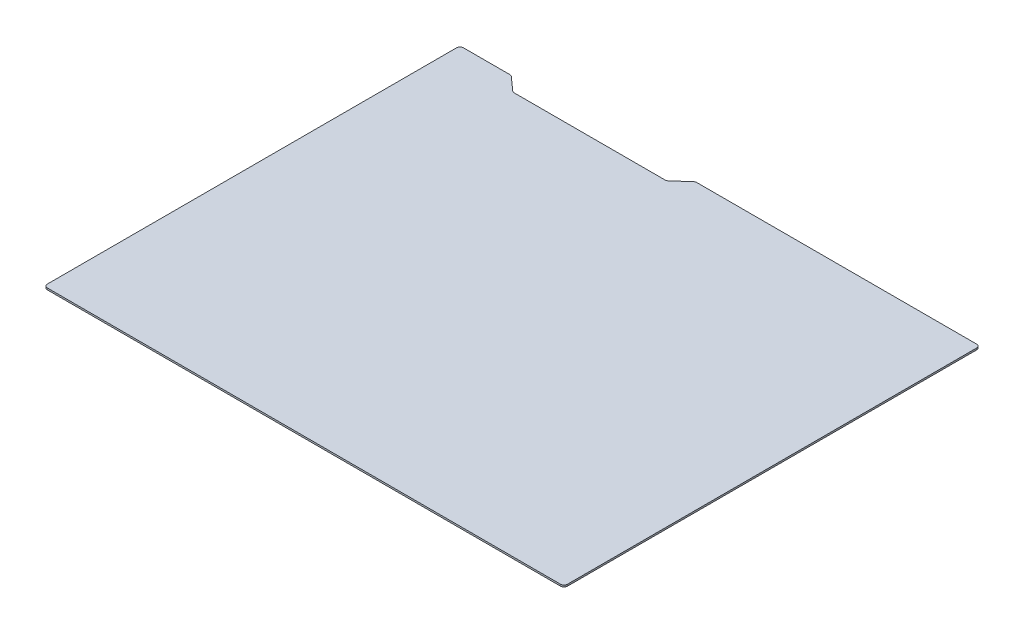
ISO-10303-21;
HEADER;
FILE_DESCRIPTION(('STEP AP214'),'2;1');
FILE_NAME('part.step','',(''),(''),'','','');
FILE_SCHEMA(('AUTOMOTIVE_DESIGN { 1 0 10303 214 1 1 1 1 }'));
ENDSEC;
DATA;
#1=APPLICATION_CONTEXT('core data for automotive mechanical design processes');
#2=APPLICATION_PROTOCOL_DEFINITION('international standard','automotive_design',2000,#1);
#3=PRODUCT_CONTEXT('',#1,'mechanical');
#4=PRODUCT('Part','Part','',(#3));
#5=PRODUCT_RELATED_PRODUCT_CATEGORY('part','',(#4));
#6=PRODUCT_DEFINITION_FORMATION('','',#4);
#7=PRODUCT_DEFINITION_CONTEXT('part definition',#1,'design');
#8=PRODUCT_DEFINITION('design','',#6,#7);
#9=PRODUCT_DEFINITION_SHAPE('','',#8);
#10=(LENGTH_UNIT() NAMED_UNIT(*) SI_UNIT(.MILLI.,.METRE.));
#11=(NAMED_UNIT(*) PLANE_ANGLE_UNIT() SI_UNIT($,.RADIAN.));
#12=(NAMED_UNIT(*) SI_UNIT($,.STERADIAN.) SOLID_ANGLE_UNIT());
#13=UNCERTAINTY_MEASURE_WITH_UNIT(LENGTH_MEASURE(1.E-05),#10,'distance_accuracy_value','');
#14=(GEOMETRIC_REPRESENTATION_CONTEXT(3) GLOBAL_UNCERTAINTY_ASSIGNED_CONTEXT((#13)) GLOBAL_UNIT_ASSIGNED_CONTEXT((#10,
#11,#12)) REPRESENTATION_CONTEXT('',''));
#15=CARTESIAN_POINT('',(0.,0.,0.));
#16=DIRECTION('',(0.,0.,1.));
#17=DIRECTION('',(1.,0.,0.));
#18=AXIS2_PLACEMENT_3D('',#15,#16,#17);
#19=CARTESIAN_POINT('',(152.4,1.,-121.92));
#20=DIRECTION('',(-1.,0.,0.));
#21=DIRECTION('',(0.,0.,1.));
#22=AXIS2_PLACEMENT_3D('',#19,#20,#21);
#23=PLANE('',#22);
#24=DIRECTION('',(0.,0.,-1.));
#25=VECTOR('',#24,1.);
#26=CARTESIAN_POINT('',(152.4,1.,-121.92));
#27=LINE('',#26,#25);
#28=CARTESIAN_POINT('',(152.4,1.,119.92));
#29=VERTEX_POINT('',#28);
#30=CARTESIAN_POINT('',(152.4,1.,-119.92));
#31=VERTEX_POINT('',#30);
#32=EDGE_CURVE('E195',#29,#31,#27,.T.);
#33=ORIENTED_EDGE('',*,*,#32,.F.);
#34=DIRECTION('',(0.,-1.,0.));
#35=VECTOR('',#34,1.);
#36=CARTESIAN_POINT('',(152.4,1.,119.92));
#37=LINE('',#36,#35);
#38=CARTESIAN_POINT('',(152.4,0.,119.92));
#39=VERTEX_POINT('',#38);
#40=EDGE_CURVE('E250',#29,#39,#37,.T.);
#41=ORIENTED_EDGE('',*,*,#40,.T.);
#42=DIRECTION('',(0.,0.,-1.));
#43=VECTOR('',#42,1.);
#44=CARTESIAN_POINT('',(152.4,0.,-121.92));
#45=LINE('',#44,#43);
#46=CARTESIAN_POINT('',(152.4,0.,-119.92));
#47=VERTEX_POINT('',#46);
#48=EDGE_CURVE('E180',#39,#47,#45,.T.);
#49=ORIENTED_EDGE('',*,*,#48,.T.);
#50=DIRECTION('',(0.,-1.,0.));
#51=VECTOR('',#50,1.);
#52=CARTESIAN_POINT('',(152.4,1.,-119.92));
#53=LINE('',#52,#51);
#54=EDGE_CURVE('E48',#47,#31,#53,.F.);
#55=ORIENTED_EDGE('',*,*,#54,.T.);
#56=EDGE_LOOP('',(#33,#41,#49,#55));
#57=FACE_BOUND('',#56,.T.);
#58=ADVANCED_FACE('F33',(#57),#23,.F.);
#59=CARTESIAN_POINT('',(-14.4000000000001,1.,-121.92));
#60=DIRECTION('',(0.,0.,1.));
#61=DIRECTION('',(1.,0.,0.));
#62=AXIS2_PLACEMENT_3D('',#59,#60,#61);
#63=PLANE('',#62);
#64=DIRECTION('',(-1.,0.,0.));
#65=VECTOR('',#64,1.);
#66=CARTESIAN_POINT('',(-14.4000000000001,1.,-121.92));
#67=LINE('',#66,#65);
#68=CARTESIAN_POINT('',(150.4,1.,-121.92));
#69=VERTEX_POINT('',#68);
#70=CARTESIAN_POINT('',(-13.639601355302,1.,-121.92));
#71=VERTEX_POINT('',#70);
#72=EDGE_CURVE('E257',#69,#71,#67,.T.);
#73=ORIENTED_EDGE('',*,*,#72,.F.);
#74=DIRECTION('',(0.,-1.,0.));
#75=VECTOR('',#74,1.);
#76=CARTESIAN_POINT('',(150.4,1.,-121.92));
#77=LINE('',#76,#75);
#78=CARTESIAN_POINT('',(150.4,0.,-121.92));
#79=VERTEX_POINT('',#78);
#80=EDGE_CURVE('E41',#69,#79,#77,.T.);
#81=ORIENTED_EDGE('',*,*,#80,.T.);
#82=DIRECTION('',(-1.,0.,0.));
#83=VECTOR('',#82,1.);
#84=CARTESIAN_POINT('',(-14.4000000000001,0.,-121.92));
#85=LINE('',#84,#83);
#86=CARTESIAN_POINT('',(-13.639601355302,0.,-121.92));
#87=VERTEX_POINT('',#86);
#88=EDGE_CURVE('E175',#79,#87,#85,.T.);
#89=ORIENTED_EDGE('',*,*,#88,.T.);
#90=DIRECTION('',(0.,-1.,0.));
#91=VECTOR('',#90,1.);
#92=CARTESIAN_POINT('',(-13.639601355302,1.,-121.92));
#93=LINE('',#92,#91);
#94=EDGE_CURVE('E154',#87,#71,#93,.F.);
#95=ORIENTED_EDGE('',*,*,#94,.T.);
#96=EDGE_LOOP('',(#73,#81,#89,#95));
#97=FACE_BOUND('',#96,.T.);
#98=ADVANCED_FACE('F256',(#97),#63,.F.);
#99=CARTESIAN_POINT('',(-23.4000000000001,1.,-113.92));
#100=DIRECTION('',(0.664363838829912,0.,0.747409318683666));
#101=DIRECTION('',(0.747409318683666,0.,-0.664363838829913));
#102=AXIS2_PLACEMENT_3D('',#99,#100,#101);
#103=PLANE('',#102);
#104=DIRECTION('',(-0.747409318683666,0.,0.664363838829912));
#105=VECTOR('',#104,1.);
#106=CARTESIAN_POINT('',(-23.4000000000001,1.,-113.92));
#107=LINE('',#106,#105);
#108=CARTESIAN_POINT('',(-14.9683290329619,1.,-121.414818637367));
#109=VERTEX_POINT('',#108);
#110=CARTESIAN_POINT('',(-22.8316709670384,1.,-114.425181362633));
#111=VERTEX_POINT('',#110);
#112=EDGE_CURVE('E167',#109,#111,#107,.T.);
#113=ORIENTED_EDGE('',*,*,#112,.F.);
#114=DIRECTION('',(0.,-1.,0.));
#115=VECTOR('',#114,1.);
#116=CARTESIAN_POINT('',(-14.9683290329619,1.,-121.414818637367));
#117=LINE('',#116,#115);
#118=CARTESIAN_POINT('',(-14.9683290329619,0.,-121.414818637367));
#119=VERTEX_POINT('',#118);
#120=EDGE_CURVE('E152',#109,#119,#117,.T.);
#121=ORIENTED_EDGE('',*,*,#120,.T.);
#122=DIRECTION('',(-0.747409318683666,0.,0.664363838829912));
#123=VECTOR('',#122,1.);
#124=CARTESIAN_POINT('',(-23.4000000000001,0.,-113.92));
#125=LINE('',#124,#123);
#126=CARTESIAN_POINT('',(-22.8316709670384,0.,-114.425181362633));
#127=VERTEX_POINT('',#126);
#128=EDGE_CURVE('E164',#119,#127,#125,.T.);
#129=ORIENTED_EDGE('',*,*,#128,.T.);
#130=DIRECTION('',(0.,-1.,0.));
#131=VECTOR('',#130,1.);
#132=CARTESIAN_POINT('',(-22.8316709670384,1.,-114.425181362633));
#133=LINE('',#132,#131);
#134=EDGE_CURVE('E168',#127,#111,#133,.F.);
#135=ORIENTED_EDGE('',*,*,#134,.T.);
#136=EDGE_LOOP('',(#113,#121,#129,#135));
#137=FACE_BOUND('',#136,.T.);
#138=ADVANCED_FACE('F163',(#137),#103,.F.);
#139=CARTESIAN_POINT('',(-113.4,1.,-113.92));
#140=DIRECTION('',(0.,0.,1.));
#141=DIRECTION('',(1.,0.,0.));
#142=AXIS2_PLACEMENT_3D('',#139,#140,#141);
#143=PLANE('',#142);
#144=DIRECTION('',(-1.,0.,0.));
#145=VECTOR('',#144,1.);
#146=CARTESIAN_POINT('',(-113.4,1.,-113.92));
#147=LINE('',#146,#145);
#148=CARTESIAN_POINT('',(-24.1603986446982,1.,-113.92));
#149=VERTEX_POINT('',#148);
#150=CARTESIAN_POINT('',(-112.639601355302,1.,-113.92));
#151=VERTEX_POINT('',#150);
#152=EDGE_CURVE('E269',#149,#151,#147,.T.);
#153=ORIENTED_EDGE('',*,*,#152,.F.);
#154=DIRECTION('',(0.,-1.,0.));
#155=VECTOR('',#154,1.);
#156=CARTESIAN_POINT('',(-24.1603986446982,0.,-113.92));
#157=LINE('',#156,#155);
#158=CARTESIAN_POINT('',(-24.1603986446982,0.,-113.92));
#159=VERTEX_POINT('',#158);
#160=EDGE_CURVE('E206',#149,#159,#157,.T.);
#161=ORIENTED_EDGE('',*,*,#160,.T.);
#162=DIRECTION('',(-1.,0.,0.));
#163=VECTOR('',#162,1.);
#164=CARTESIAN_POINT('',(-113.4,0.,-113.92));
#165=LINE('',#164,#163);
#166=CARTESIAN_POINT('',(-112.639601355302,0.,-113.92));
#167=VERTEX_POINT('',#166);
#168=EDGE_CURVE('E174',#159,#167,#165,.T.);
#169=ORIENTED_EDGE('',*,*,#168,.T.);
#170=DIRECTION('',(0.,-1.,0.));
#171=VECTOR('',#170,1.);
#172=CARTESIAN_POINT('',(-112.639601355302,1.,-113.92));
#173=LINE('',#172,#171);
#174=EDGE_CURVE('E204',#167,#151,#173,.F.);
#175=ORIENTED_EDGE('',*,*,#174,.T.);
#176=EDGE_LOOP('',(#153,#161,#169,#175));
#177=FACE_BOUND('',#176,.T.);
#178=ADVANCED_FACE('F319',(#177),#143,.F.);
#179=CARTESIAN_POINT('',(-113.4,1.,-113.92));
#180=DIRECTION('',(-0.664363838829919,0.,0.74740931868366));
#181=DIRECTION('',(0.74740931868366,0.,0.664363838829919));
#182=AXIS2_PLACEMENT_3D('',#179,#180,#181);
#183=PLANE('',#182);
#184=DIRECTION('',(-0.74740931868366,0.,-0.664363838829919));
#185=VECTOR('',#184,1.);
#186=CARTESIAN_POINT('',(-113.4,0.,-113.92));
#187=LINE('',#186,#185);
#188=CARTESIAN_POINT('',(-113.968329032962,0.,-114.425181362633));
#189=VERTEX_POINT('',#188);
#190=CARTESIAN_POINT('',(-121.831670967038,0.,-121.414818637367));
#191=VERTEX_POINT('',#190);
#192=EDGE_CURVE('E178',#189,#191,#187,.T.);
#193=ORIENTED_EDGE('',*,*,#192,.T.);
#194=DIRECTION('',(0.,-1.,0.));
#195=VECTOR('',#194,1.);
#196=CARTESIAN_POINT('',(-121.831670967038,1.,-121.414818637367));
#197=LINE('',#196,#195);
#198=CARTESIAN_POINT('',(-121.831670967038,1.,-121.414818637367));
#199=VERTEX_POINT('',#198);
#200=EDGE_CURVE('E215',#191,#199,#197,.F.);
#201=ORIENTED_EDGE('',*,*,#200,.T.);
#202=DIRECTION('',(-0.74740931868366,0.,-0.664363838829919));
#203=VECTOR('',#202,1.);
#204=CARTESIAN_POINT('',(-113.4,1.,-113.92));
#205=LINE('',#204,#203);
#206=CARTESIAN_POINT('',(-113.968329032962,1.,-114.425181362633));
#207=VERTEX_POINT('',#206);
#208=EDGE_CURVE('E272',#207,#199,#205,.T.);
#209=ORIENTED_EDGE('',*,*,#208,.F.);
#210=DIRECTION('',(0.,-1.,0.));
#211=VECTOR('',#210,1.);
#212=CARTESIAN_POINT('',(-113.968329032962,0.,-114.425181362633));
#213=LINE('',#212,#211);
#214=EDGE_CURVE('E212',#207,#189,#213,.T.);
#215=ORIENTED_EDGE('',*,*,#214,.T.);
#216=EDGE_LOOP('',(#193,#201,#209,#215));
#217=FACE_BOUND('',#216,.T.);
#218=ADVANCED_FACE('F310',(#217),#183,.F.);
#219=CARTESIAN_POINT('',(-152.4,1.,-121.92));
#220=DIRECTION('',(0.,0.,1.));
#221=DIRECTION('',(1.,0.,0.));
#222=AXIS2_PLACEMENT_3D('',#219,#220,#221);
#223=PLANE('',#222);
#224=DIRECTION('',(-1.,0.,0.));
#225=VECTOR('',#224,1.);
#226=CARTESIAN_POINT('',(-152.4,0.,-121.92));
#227=LINE('',#226,#225);
#228=CARTESIAN_POINT('',(-123.160398644698,0.,-121.92));
#229=VERTEX_POINT('',#228);
#230=CARTESIAN_POINT('',(-150.4,0.,-121.92));
#231=VERTEX_POINT('',#230);
#232=EDGE_CURVE('E186',#229,#231,#227,.T.);
#233=ORIENTED_EDGE('',*,*,#232,.T.);
#234=DIRECTION('',(0.,-1.,0.));
#235=VECTOR('',#234,1.);
#236=CARTESIAN_POINT('',(-150.4,1.,-121.92));
#237=LINE('',#236,#235);
#238=CARTESIAN_POINT('',(-150.4,1.,-121.92));
#239=VERTEX_POINT('',#238);
#240=EDGE_CURVE('E11',#231,#239,#237,.F.);
#241=ORIENTED_EDGE('',*,*,#240,.T.);
#242=DIRECTION('',(-1.,0.,0.));
#243=VECTOR('',#242,1.);
#244=CARTESIAN_POINT('',(-152.4,1.,-121.92));
#245=LINE('',#244,#243);
#246=CARTESIAN_POINT('',(-123.160398644698,1.,-121.92));
#247=VERTEX_POINT('',#246);
#248=EDGE_CURVE('E275',#247,#239,#245,.T.);
#249=ORIENTED_EDGE('',*,*,#248,.F.);
#250=DIRECTION('',(0.,-1.,0.));
#251=VECTOR('',#250,1.);
#252=CARTESIAN_POINT('',(-123.160398644698,1.,-121.92));
#253=LINE('',#252,#251);
#254=EDGE_CURVE('E209',#247,#229,#253,.T.);
#255=ORIENTED_EDGE('',*,*,#254,.T.);
#256=EDGE_LOOP('',(#233,#241,#249,#255));
#257=FACE_BOUND('',#256,.T.);
#258=ADVANCED_FACE('F301',(#257),#223,.F.);
#259=CARTESIAN_POINT('',(-152.4,1.,-121.92));
#260=DIRECTION('',(1.,0.,0.));
#261=DIRECTION('',(0.,0.,-1.));
#262=AXIS2_PLACEMENT_3D('',#259,#260,#261);
#263=PLANE('',#262);
#264=DIRECTION('',(0.,0.,1.));
#265=VECTOR('',#264,1.);
#266=CARTESIAN_POINT('',(-152.4,0.,-121.92));
#267=LINE('',#266,#265);
#268=CARTESIAN_POINT('',(-152.4,0.,-119.92));
#269=VERTEX_POINT('',#268);
#270=CARTESIAN_POINT('',(-152.4,0.,119.92));
#271=VERTEX_POINT('',#270);
#272=EDGE_CURVE('E189',#269,#271,#267,.T.);
#273=ORIENTED_EDGE('',*,*,#272,.T.);
#274=DIRECTION('',(0.,-1.,0.));
#275=VECTOR('',#274,1.);
#276=CARTESIAN_POINT('',(-152.4,1.,119.92));
#277=LINE('',#276,#275);
#278=CARTESIAN_POINT('',(-152.4,1.,119.92));
#279=VERTEX_POINT('',#278);
#280=EDGE_CURVE('E240',#271,#279,#277,.F.);
#281=ORIENTED_EDGE('',*,*,#280,.T.);
#282=DIRECTION('',(0.,0.,1.));
#283=VECTOR('',#282,1.);
#284=CARTESIAN_POINT('',(-152.4,1.,-121.92));
#285=LINE('',#284,#283);
#286=CARTESIAN_POINT('',(-152.4,1.,-119.92));
#287=VERTEX_POINT('',#286);
#288=EDGE_CURVE('E278',#287,#279,#285,.T.);
#289=ORIENTED_EDGE('',*,*,#288,.F.);
#290=DIRECTION('',(0.,-1.,0.));
#291=VECTOR('',#290,1.);
#292=CARTESIAN_POINT('',(-152.4,1.,-119.92));
#293=LINE('',#292,#291);
#294=EDGE_CURVE('E237',#287,#269,#293,.T.);
#295=ORIENTED_EDGE('',*,*,#294,.T.);
#296=EDGE_LOOP('',(#273,#281,#289,#295));
#297=FACE_BOUND('',#296,.T.);
#298=ADVANCED_FACE('F293',(#297),#263,.F.);
#299=CARTESIAN_POINT('',(-152.4,1.,121.92));
#300=DIRECTION('',(0.,0.,-1.));
#301=DIRECTION('',(-1.,0.,0.));
#302=AXIS2_PLACEMENT_3D('',#299,#300,#301);
#303=PLANE('',#302);
#304=DIRECTION('',(1.,0.,0.));
#305=VECTOR('',#304,1.);
#306=CARTESIAN_POINT('',(-152.4,1.,121.92));
#307=LINE('',#306,#305);
#308=CARTESIAN_POINT('',(-150.4,1.,121.92));
#309=VERTEX_POINT('',#308);
#310=CARTESIAN_POINT('',(150.4,1.,121.92));
#311=VERTEX_POINT('',#310);
#312=EDGE_CURVE('E196',#309,#311,#307,.T.);
#313=ORIENTED_EDGE('',*,*,#312,.F.);
#314=DIRECTION('',(0.,-1.,0.));
#315=VECTOR('',#314,1.);
#316=CARTESIAN_POINT('',(-150.4,1.,121.92));
#317=LINE('',#316,#315);
#318=CARTESIAN_POINT('',(-150.4,0.,121.92));
#319=VERTEX_POINT('',#318);
#320=EDGE_CURVE('E226',#309,#319,#317,.T.);
#321=ORIENTED_EDGE('',*,*,#320,.T.);
#322=DIRECTION('',(1.,0.,0.));
#323=VECTOR('',#322,1.);
#324=CARTESIAN_POINT('',(-152.4,0.,121.92));
#325=LINE('',#324,#323);
#326=CARTESIAN_POINT('',(150.4,0.,121.92));
#327=VERTEX_POINT('',#326);
#328=EDGE_CURVE('E192',#319,#327,#325,.T.);
#329=ORIENTED_EDGE('',*,*,#328,.T.);
#330=DIRECTION('',(0.,-1.,0.));
#331=VECTOR('',#330,1.);
#332=CARTESIAN_POINT('',(150.4,1.,121.92));
#333=LINE('',#332,#331);
#334=EDGE_CURVE('E224',#327,#311,#333,.F.);
#335=ORIENTED_EDGE('',*,*,#334,.T.);
#336=EDGE_LOOP('',(#313,#321,#329,#335));
#337=FACE_BOUND('',#336,.T.);
#338=ADVANCED_FACE('F287',(#337),#303,.F.);
#339=CARTESIAN_POINT('',(0.,1.,0.));
#340=DIRECTION('',(0.,1.,0.));
#341=DIRECTION('',(0.,0.,1.));
#342=AXIS2_PLACEMENT_3D('',#339,#340,#341);
#343=PLANE('',#342);
#344=ORIENTED_EDGE('',*,*,#288,.T.);
#345=CARTESIAN_POINT('',(-150.4,1.,119.92));
#346=DIRECTION('',(0.,1.,0.));
#347=DIRECTION('',(0.,0.,1.));
#348=AXIS2_PLACEMENT_3D('',#345,#346,#347);
#349=CIRCLE('',#348,2.);
#350=EDGE_CURVE('E247',#279,#309,#349,.T.);
#351=ORIENTED_EDGE('',*,*,#350,.T.);
#352=ORIENTED_EDGE('',*,*,#312,.T.);
#353=CARTESIAN_POINT('',(150.4,1.,119.92));
#354=DIRECTION('',(0.,1.,0.));
#355=DIRECTION('',(0.,0.,1.));
#356=AXIS2_PLACEMENT_3D('',#353,#354,#355);
#357=CIRCLE('',#356,2.);
#358=EDGE_CURVE('E55',#311,#29,#357,.T.);
#359=ORIENTED_EDGE('',*,*,#358,.T.);
#360=ORIENTED_EDGE('',*,*,#32,.T.);
#361=CARTESIAN_POINT('',(150.4,1.,-119.92));
#362=DIRECTION('',(0.,1.,0.));
#363=DIRECTION('',(0.,0.,1.));
#364=AXIS2_PLACEMENT_3D('',#361,#362,#363);
#365=CIRCLE('',#364,2.);
#366=EDGE_CURVE('E244',#31,#69,#365,.T.);
#367=ORIENTED_EDGE('',*,*,#366,.T.);
#368=ORIENTED_EDGE('',*,*,#72,.T.);
#369=CARTESIAN_POINT('',(-13.639601355302,1.,-119.92));
#370=DIRECTION('',(0.,1.,0.));
#371=DIRECTION('',(0.,0.,1.));
#372=AXIS2_PLACEMENT_3D('',#369,#370,#371);
#373=CIRCLE('',#372,2.);
#374=EDGE_CURVE('E202',#71,#109,#373,.T.);
#375=ORIENTED_EDGE('',*,*,#374,.T.);
#376=ORIENTED_EDGE('',*,*,#112,.T.);
#377=CARTESIAN_POINT('',(-24.1603986446982,1.,-115.92));
#378=DIRECTION('',(0.,1.,0.));
#379=DIRECTION('',(0.,0.,1.));
#380=AXIS2_PLACEMENT_3D('',#377,#378,#379);
#381=CIRCLE('',#380,2.);
#382=EDGE_CURVE('E218',#111,#149,#381,.F.);
#383=ORIENTED_EDGE('',*,*,#382,.T.);
#384=ORIENTED_EDGE('',*,*,#152,.T.);
#385=CARTESIAN_POINT('',(-112.639601355302,1.,-115.92));
#386=DIRECTION('',(0.,1.,0.));
#387=DIRECTION('',(0.,0.,1.));
#388=AXIS2_PLACEMENT_3D('',#385,#386,#387);
#389=CIRCLE('',#388,2.);
#390=EDGE_CURVE('E222',#151,#207,#389,.F.);
#391=ORIENTED_EDGE('',*,*,#390,.T.);
#392=ORIENTED_EDGE('',*,*,#208,.T.);
#393=CARTESIAN_POINT('',(-123.160398644698,1.,-119.92));
#394=DIRECTION('',(0.,1.,0.));
#395=DIRECTION('',(0.,0.,1.));
#396=AXIS2_PLACEMENT_3D('',#393,#394,#395);
#397=CIRCLE('',#396,2.);
#398=EDGE_CURVE('E200',#199,#247,#397,.T.);
#399=ORIENTED_EDGE('',*,*,#398,.T.);
#400=ORIENTED_EDGE('',*,*,#248,.T.);
#401=CARTESIAN_POINT('',(-150.4,1.,-119.92));
#402=DIRECTION('',(0.,1.,0.));
#403=DIRECTION('',(0.,0.,1.));
#404=AXIS2_PLACEMENT_3D('',#401,#402,#403);
#405=CIRCLE('',#404,2.);
#406=EDGE_CURVE('E242',#239,#287,#405,.T.);
#407=ORIENTED_EDGE('',*,*,#406,.T.);
#408=EDGE_LOOP('',(#344,#351,#352,#359,#360,#367,#368,#375,#376,#383,#384,#391,#392,#399,#400,#407));
#409=FACE_BOUND('',#408,.T.);
#410=ADVANCED_FACE('F264',(#409),#343,.T.);
#411=CARTESIAN_POINT('',(0.,0.,0.));
#412=DIRECTION('',(0.,1.,0.));
#413=DIRECTION('',(0.,0.,1.));
#414=AXIS2_PLACEMENT_3D('',#411,#412,#413);
#415=PLANE('',#414);
#416=ORIENTED_EDGE('',*,*,#328,.F.);
#417=CARTESIAN_POINT('',(-150.4,0.,119.92));
#418=DIRECTION('',(0.,1.,0.));
#419=DIRECTION('',(0.,0.,1.));
#420=AXIS2_PLACEMENT_3D('',#417,#418,#419);
#421=CIRCLE('',#420,2.);
#422=EDGE_CURVE('E235',#319,#271,#421,.F.);
#423=ORIENTED_EDGE('',*,*,#422,.T.);
#424=ORIENTED_EDGE('',*,*,#272,.F.);
#425=CARTESIAN_POINT('',(-150.4,0.,-119.92));
#426=DIRECTION('',(0.,1.,0.));
#427=DIRECTION('',(0.,0.,1.));
#428=AXIS2_PLACEMENT_3D('',#425,#426,#427);
#429=CIRCLE('',#428,2.);
#430=EDGE_CURVE('E229',#269,#231,#429,.F.);
#431=ORIENTED_EDGE('',*,*,#430,.T.);
#432=ORIENTED_EDGE('',*,*,#232,.F.);
#433=CARTESIAN_POINT('',(-123.160398644698,0.,-119.92));
#434=DIRECTION('',(0.,1.,0.));
#435=DIRECTION('',(0.,0.,1.));
#436=AXIS2_PLACEMENT_3D('',#433,#434,#435);
#437=CIRCLE('',#436,2.);
#438=EDGE_CURVE('E158',#229,#191,#437,.F.);
#439=ORIENTED_EDGE('',*,*,#438,.T.);
#440=ORIENTED_EDGE('',*,*,#192,.F.);
#441=CARTESIAN_POINT('',(-112.639601355302,0.,-115.92));
#442=DIRECTION('',(0.,1.,0.));
#443=DIRECTION('',(0.,0.,1.));
#444=AXIS2_PLACEMENT_3D('',#441,#442,#443);
#445=CIRCLE('',#444,2.);
#446=EDGE_CURVE('E220',#189,#167,#445,.T.);
#447=ORIENTED_EDGE('',*,*,#446,.T.);
#448=ORIENTED_EDGE('',*,*,#168,.F.);
#449=CARTESIAN_POINT('',(-24.1603986446982,0.,-115.92));
#450=DIRECTION('',(0.,1.,0.));
#451=DIRECTION('',(0.,0.,1.));
#452=AXIS2_PLACEMENT_3D('',#449,#450,#451);
#453=CIRCLE('',#452,2.);
#454=EDGE_CURVE('E173',#159,#127,#453,.T.);
#455=ORIENTED_EDGE('',*,*,#454,.T.);
#456=ORIENTED_EDGE('',*,*,#128,.F.);
#457=CARTESIAN_POINT('',(-13.639601355302,0.,-119.92));
#458=DIRECTION('',(0.,1.,0.));
#459=DIRECTION('',(0.,0.,1.));
#460=AXIS2_PLACEMENT_3D('',#457,#458,#459);
#461=CIRCLE('',#460,2.);
#462=EDGE_CURVE('E148',#119,#87,#461,.F.);
#463=ORIENTED_EDGE('',*,*,#462,.T.);
#464=ORIENTED_EDGE('',*,*,#88,.F.);
#465=CARTESIAN_POINT('',(150.4,0.,-119.92));
#466=DIRECTION('',(0.,1.,0.));
#467=DIRECTION('',(0.,0.,1.));
#468=AXIS2_PLACEMENT_3D('',#465,#466,#467);
#469=CIRCLE('',#468,2.);
#470=EDGE_CURVE('E231',#79,#47,#469,.F.);
#471=ORIENTED_EDGE('',*,*,#470,.T.);
#472=ORIENTED_EDGE('',*,*,#48,.F.);
#473=CARTESIAN_POINT('',(150.4,0.,119.92));
#474=DIRECTION('',(0.,1.,0.));
#475=DIRECTION('',(0.,0.,1.));
#476=AXIS2_PLACEMENT_3D('',#473,#474,#475);
#477=CIRCLE('',#476,2.);
#478=EDGE_CURVE('E233',#39,#327,#477,.F.);
#479=ORIENTED_EDGE('',*,*,#478,.T.);
#480=EDGE_LOOP('',(#416,#423,#424,#431,#432,#439,#440,#447,#448,#455,#456,#463,#464,#471,#472,#479));
#481=FACE_BOUND('',#480,.T.);
#482=ADVANCED_FACE('F171',(#481),#415,.F.);
#483=CARTESIAN_POINT('',(-13.639601355302,1.,-119.92));
#484=DIRECTION('',(0.,-1.,0.));
#485=DIRECTION('',(0.,0.,-1.));
#486=AXIS2_PLACEMENT_3D('',#483,#484,#485);
#487=CYLINDRICAL_SURFACE('',#486,2.);
#488=ORIENTED_EDGE('',*,*,#374,.F.);
#489=ORIENTED_EDGE('',*,*,#94,.F.);
#490=ORIENTED_EDGE('',*,*,#462,.F.);
#491=ORIENTED_EDGE('',*,*,#120,.F.);
#492=EDGE_LOOP('',(#488,#489,#490,#491));
#493=FACE_BOUND('',#492,.T.);
#494=ADVANCED_FACE('F151',(#493),#487,.T.);
#495=CARTESIAN_POINT('',(-24.1603986446982,1.,-115.92));
#496=DIRECTION('',(0.,1.,0.));
#497=DIRECTION('',(0.,0.,1.));
#498=AXIS2_PLACEMENT_3D('',#495,#496,#497);
#499=CYLINDRICAL_SURFACE('',#498,2.);
#500=ORIENTED_EDGE('',*,*,#382,.F.);
#501=ORIENTED_EDGE('',*,*,#134,.F.);
#502=ORIENTED_EDGE('',*,*,#454,.F.);
#503=ORIENTED_EDGE('',*,*,#160,.F.);
#504=EDGE_LOOP('',(#500,#501,#502,#503));
#505=FACE_BOUND('',#504,.T.);
#506=ADVANCED_FACE('F323',(#505),#499,.F.);
#507=CARTESIAN_POINT('',(-123.160398644698,1.,-119.92));
#508=DIRECTION('',(0.,-1.,0.));
#509=DIRECTION('',(0.,0.,-1.));
#510=AXIS2_PLACEMENT_3D('',#507,#508,#509);
#511=CYLINDRICAL_SURFACE('',#510,2.);
#512=ORIENTED_EDGE('',*,*,#398,.F.);
#513=ORIENTED_EDGE('',*,*,#200,.F.);
#514=ORIENTED_EDGE('',*,*,#438,.F.);
#515=ORIENTED_EDGE('',*,*,#254,.F.);
#516=EDGE_LOOP('',(#512,#513,#514,#515));
#517=FACE_BOUND('',#516,.T.);
#518=ADVANCED_FACE('F306',(#517),#511,.T.);
#519=CARTESIAN_POINT('',(-112.639601355302,1.,-115.92));
#520=DIRECTION('',(0.,1.,0.));
#521=DIRECTION('',(0.,0.,1.));
#522=AXIS2_PLACEMENT_3D('',#519,#520,#521);
#523=CYLINDRICAL_SURFACE('',#522,2.);
#524=ORIENTED_EDGE('',*,*,#390,.F.);
#525=ORIENTED_EDGE('',*,*,#174,.F.);
#526=ORIENTED_EDGE('',*,*,#446,.F.);
#527=ORIENTED_EDGE('',*,*,#214,.F.);
#528=EDGE_LOOP('',(#524,#525,#526,#527));
#529=FACE_BOUND('',#528,.T.);
#530=ADVANCED_FACE('F315',(#529),#523,.F.);
#531=CARTESIAN_POINT('',(-150.4,1.,119.92));
#532=DIRECTION('',(0.,-1.,0.));
#533=DIRECTION('',(0.,0.,-1.));
#534=AXIS2_PLACEMENT_3D('',#531,#532,#533);
#535=CYLINDRICAL_SURFACE('',#534,2.);
#536=ORIENTED_EDGE('',*,*,#350,.F.);
#537=ORIENTED_EDGE('',*,*,#280,.F.);
#538=ORIENTED_EDGE('',*,*,#422,.F.);
#539=ORIENTED_EDGE('',*,*,#320,.F.);
#540=EDGE_LOOP('',(#536,#537,#538,#539));
#541=FACE_BOUND('',#540,.T.);
#542=ADVANCED_FACE('F289',(#541),#535,.T.);
#543=CARTESIAN_POINT('',(150.4,1.,119.92));
#544=DIRECTION('',(0.,-1.,0.));
#545=DIRECTION('',(0.,0.,-1.));
#546=AXIS2_PLACEMENT_3D('',#543,#544,#545);
#547=CYLINDRICAL_SURFACE('',#546,2.);
#548=ORIENTED_EDGE('',*,*,#358,.F.);
#549=ORIENTED_EDGE('',*,*,#334,.F.);
#550=ORIENTED_EDGE('',*,*,#478,.F.);
#551=ORIENTED_EDGE('',*,*,#40,.F.);
#552=EDGE_LOOP('',(#548,#549,#550,#551));
#553=FACE_BOUND('',#552,.T.);
#554=ADVANCED_FACE('F286',(#553),#547,.T.);
#555=CARTESIAN_POINT('',(150.4,1.,-119.92));
#556=DIRECTION('',(0.,-1.,0.));
#557=DIRECTION('',(0.,0.,-1.));
#558=AXIS2_PLACEMENT_3D('',#555,#556,#557);
#559=CYLINDRICAL_SURFACE('',#558,2.);
#560=ORIENTED_EDGE('',*,*,#366,.F.);
#561=ORIENTED_EDGE('',*,*,#54,.F.);
#562=ORIENTED_EDGE('',*,*,#470,.F.);
#563=ORIENTED_EDGE('',*,*,#80,.F.);
#564=EDGE_LOOP('',(#560,#561,#562,#563));
#565=FACE_BOUND('',#564,.T.);
#566=ADVANCED_FACE('F262',(#565),#559,.T.);
#567=CARTESIAN_POINT('',(-150.4,1.,-119.92));
#568=DIRECTION('',(0.,-1.,0.));
#569=DIRECTION('',(0.,0.,-1.));
#570=AXIS2_PLACEMENT_3D('',#567,#568,#569);
#571=CYLINDRICAL_SURFACE('',#570,2.);
#572=ORIENTED_EDGE('',*,*,#406,.F.);
#573=ORIENTED_EDGE('',*,*,#240,.F.);
#574=ORIENTED_EDGE('',*,*,#430,.F.);
#575=ORIENTED_EDGE('',*,*,#294,.F.);
#576=EDGE_LOOP('',(#572,#573,#574,#575));
#577=FACE_BOUND('',#576,.T.);
#578=ADVANCED_FACE('F35',(#577),#571,.T.);
#579=CLOSED_SHELL('',(#58,#98,#138,#178,#218,#258,#298,#338,#410,#482,#494,#506,#518,#530,#542,
#554,#566,#578));
#580=MANIFOLD_SOLID_BREP('B2',#579);
#581=ADVANCED_BREP_SHAPE_REPRESENTATION('',(#18,#580),#14);
#582=SHAPE_DEFINITION_REPRESENTATION(#9,#581);
ENDSEC;
END-ISO-10303-21;
